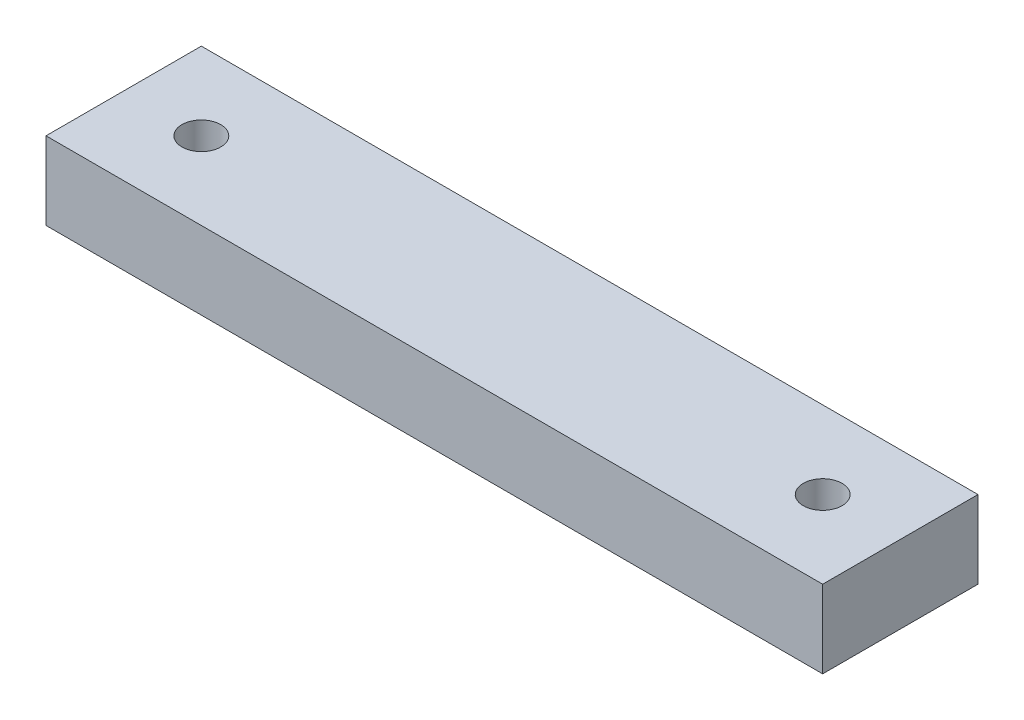
ISO-10303-21;
HEADER;
FILE_DESCRIPTION(('STEP AP214'),'2;1');
FILE_NAME('part.step','',(''),(''),'','','');
FILE_SCHEMA(('AUTOMOTIVE_DESIGN { 1 0 10303 214 1 1 1 1 }'));
ENDSEC;
DATA;
#1=APPLICATION_CONTEXT('core data for automotive mechanical design processes');
#2=APPLICATION_PROTOCOL_DEFINITION('international standard','automotive_design',2000,#1);
#3=PRODUCT_CONTEXT('',#1,'mechanical');
#4=PRODUCT('Part','Part','',(#3));
#5=PRODUCT_RELATED_PRODUCT_CATEGORY('part','',(#4));
#6=PRODUCT_DEFINITION_FORMATION('','',#4);
#7=PRODUCT_DEFINITION_CONTEXT('part definition',#1,'design');
#8=PRODUCT_DEFINITION('design','',#6,#7);
#9=PRODUCT_DEFINITION_SHAPE('','',#8);
#10=(LENGTH_UNIT() NAMED_UNIT(*) SI_UNIT(.MILLI.,.METRE.));
#11=(NAMED_UNIT(*) PLANE_ANGLE_UNIT() SI_UNIT($,.RADIAN.));
#12=(NAMED_UNIT(*) SI_UNIT($,.STERADIAN.) SOLID_ANGLE_UNIT());
#13=UNCERTAINTY_MEASURE_WITH_UNIT(LENGTH_MEASURE(1.E-05),#10,'distance_accuracy_value','');
#14=(GEOMETRIC_REPRESENTATION_CONTEXT(3) GLOBAL_UNCERTAINTY_ASSIGNED_CONTEXT((#13)) GLOBAL_UNIT_ASSIGNED_CONTEXT((#10,
#11,#12)) REPRESENTATION_CONTEXT('',''));
#15=CARTESIAN_POINT('',(0.,0.,0.));
#16=DIRECTION('',(0.,0.,1.));
#17=DIRECTION('',(1.,0.,0.));
#18=AXIS2_PLACEMENT_3D('',#15,#16,#17);
#19=CARTESIAN_POINT('',(0.,10.,0.));
#20=DIRECTION('',(0.,-1.,0.));
#21=DIRECTION('',(0.,0.,-1.));
#22=AXIS2_PLACEMENT_3D('',#19,#20,#21);
#23=PLANE('',#22);
#24=DIRECTION('',(0.,0.,-1.));
#25=VECTOR('',#24,1.);
#26=CARTESIAN_POINT('',(50.,10.,10.));
#27=LINE('',#26,#25);
#28=CARTESIAN_POINT('',(50.,10.,10.));
#29=VERTEX_POINT('',#28);
#30=CARTESIAN_POINT('',(50.,10.,-10.));
#31=VERTEX_POINT('',#30);
#32=EDGE_CURVE('E88',#29,#31,#27,.T.);
#33=ORIENTED_EDGE('',*,*,#32,.T.);
#34=DIRECTION('',(-1.,0.,0.));
#35=VECTOR('',#34,1.);
#36=CARTESIAN_POINT('',(-50.,10.,-10.));
#37=LINE('',#36,#35);
#38=CARTESIAN_POINT('',(-50.,10.,-10.));
#39=VERTEX_POINT('',#38);
#40=EDGE_CURVE('E83',#31,#39,#37,.T.);
#41=ORIENTED_EDGE('',*,*,#40,.T.);
#42=DIRECTION('',(0.,0.,1.));
#43=VECTOR('',#42,1.);
#44=CARTESIAN_POINT('',(-50.,10.,10.));
#45=LINE('',#44,#43);
#46=CARTESIAN_POINT('',(-50.,10.,10.));
#47=VERTEX_POINT('',#46);
#48=EDGE_CURVE('E86',#39,#47,#45,.T.);
#49=ORIENTED_EDGE('',*,*,#48,.T.);
#50=DIRECTION('',(1.,0.,0.));
#51=VECTOR('',#50,1.);
#52=CARTESIAN_POINT('',(-50.,10.,10.));
#53=LINE('',#52,#51);
#54=EDGE_CURVE('E53',#47,#29,#53,.T.);
#55=ORIENTED_EDGE('',*,*,#54,.T.);
#56=EDGE_LOOP('',(#33,#41,#49,#55));
#57=FACE_BOUND('',#56,.T.);
#58=CARTESIAN_POINT('',(-40.,10.,0.));
#59=DIRECTION('',(0.,1.,0.));
#60=DIRECTION('',(0.,0.,1.));
#61=AXIS2_PLACEMENT_3D('',#58,#59,#60);
#62=CIRCLE('',#61,2.5);
#63=CARTESIAN_POINT('',(-40.,10.,2.5));
#64=VERTEX_POINT('',#63);
#65=EDGE_CURVE('E103',#64,#64,#62,.T.);
#66=ORIENTED_EDGE('',*,*,#65,.F.);
#67=EDGE_LOOP('',(#66));
#68=FACE_BOUND('',#67,.T.);
#69=CARTESIAN_POINT('',(40.,10.,0.));
#70=DIRECTION('',(0.,1.,0.));
#71=DIRECTION('',(0.,0.,1.));
#72=AXIS2_PLACEMENT_3D('',#69,#70,#71);
#73=CIRCLE('',#72,2.5);
#74=CARTESIAN_POINT('',(40.,10.,2.5));
#75=VERTEX_POINT('',#74);
#76=EDGE_CURVE('E118',#75,#75,#73,.T.);
#77=ORIENTED_EDGE('',*,*,#76,.F.);
#78=EDGE_LOOP('',(#77));
#79=FACE_BOUND('',#78,.T.);
#80=ADVANCED_FACE('F36',(#57,#68,#79),#23,.F.);
#81=CARTESIAN_POINT('',(0.,0.,0.));
#82=DIRECTION('',(0.,-1.,0.));
#83=DIRECTION('',(0.,0.,-1.));
#84=AXIS2_PLACEMENT_3D('',#81,#82,#83);
#85=PLANE('',#84);
#86=CARTESIAN_POINT('',(-40.,0.,0.));
#87=DIRECTION('',(0.,1.,0.));
#88=DIRECTION('',(0.,0.,1.));
#89=AXIS2_PLACEMENT_3D('',#86,#87,#88);
#90=CIRCLE('',#89,2.5);
#91=CARTESIAN_POINT('',(-40.,0.,2.5));
#92=VERTEX_POINT('',#91);
#93=EDGE_CURVE('E115',#92,#92,#90,.T.);
#94=ORIENTED_EDGE('',*,*,#93,.T.);
#95=EDGE_LOOP('',(#94));
#96=FACE_BOUND('',#95,.T.);
#97=DIRECTION('',(0.,0.,-1.));
#98=VECTOR('',#97,1.);
#99=CARTESIAN_POINT('',(50.,0.,10.));
#100=LINE('',#99,#98);
#101=CARTESIAN_POINT('',(50.,0.,10.));
#102=VERTEX_POINT('',#101);
#103=CARTESIAN_POINT('',(50.,0.,-10.));
#104=VERTEX_POINT('',#103);
#105=EDGE_CURVE('E100',#102,#104,#100,.T.);
#106=ORIENTED_EDGE('',*,*,#105,.F.);
#107=DIRECTION('',(1.,0.,0.));
#108=VECTOR('',#107,1.);
#109=CARTESIAN_POINT('',(-50.,0.,10.));
#110=LINE('',#109,#108);
#111=CARTESIAN_POINT('',(-50.,0.,10.));
#112=VERTEX_POINT('',#111);
#113=EDGE_CURVE('E76',#112,#102,#110,.T.);
#114=ORIENTED_EDGE('',*,*,#113,.F.);
#115=DIRECTION('',(0.,0.,1.));
#116=VECTOR('',#115,1.);
#117=CARTESIAN_POINT('',(-50.,0.,10.));
#118=LINE('',#117,#116);
#119=CARTESIAN_POINT('',(-50.,0.,-10.));
#120=VERTEX_POINT('',#119);
#121=EDGE_CURVE('E70',#120,#112,#118,.T.);
#122=ORIENTED_EDGE('',*,*,#121,.F.);
#123=DIRECTION('',(-1.,0.,0.));
#124=VECTOR('',#123,1.);
#125=CARTESIAN_POINT('',(-50.,0.,-10.));
#126=LINE('',#125,#124);
#127=EDGE_CURVE('E92',#104,#120,#126,.T.);
#128=ORIENTED_EDGE('',*,*,#127,.F.);
#129=EDGE_LOOP('',(#106,#114,#122,#128));
#130=FACE_BOUND('',#129,.T.);
#131=CARTESIAN_POINT('',(40.,0.,0.));
#132=DIRECTION('',(0.,1.,0.));
#133=DIRECTION('',(0.,0.,1.));
#134=AXIS2_PLACEMENT_3D('',#131,#132,#133);
#135=CIRCLE('',#134,2.5);
#136=CARTESIAN_POINT('',(40.,0.,2.5));
#137=VERTEX_POINT('',#136);
#138=EDGE_CURVE('E121',#137,#137,#135,.T.);
#139=ORIENTED_EDGE('',*,*,#138,.T.);
#140=EDGE_LOOP('',(#139));
#141=FACE_BOUND('',#140,.T.);
#142=ADVANCED_FACE('F111',(#96,#130,#141),#85,.T.);
#143=CARTESIAN_POINT('',(50.,10.,10.));
#144=DIRECTION('',(-1.,0.,0.));
#145=DIRECTION('',(0.,0.,1.));
#146=AXIS2_PLACEMENT_3D('',#143,#144,#145);
#147=PLANE('',#146);
#148=ORIENTED_EDGE('',*,*,#105,.T.);
#149=DIRECTION('',(0.,-1.,0.));
#150=VECTOR('',#149,1.);
#151=CARTESIAN_POINT('',(50.,10.,-10.));
#152=LINE('',#151,#150);
#153=EDGE_CURVE('E11',#31,#104,#152,.T.);
#154=ORIENTED_EDGE('',*,*,#153,.F.);
#155=ORIENTED_EDGE('',*,*,#32,.F.);
#156=DIRECTION('',(0.,-1.,0.));
#157=VECTOR('',#156,1.);
#158=CARTESIAN_POINT('',(50.,10.,10.));
#159=LINE('',#158,#157);
#160=EDGE_CURVE('E96',#29,#102,#159,.T.);
#161=ORIENTED_EDGE('',*,*,#160,.T.);
#162=EDGE_LOOP('',(#148,#154,#155,#161));
#163=FACE_BOUND('',#162,.T.);
#164=ADVANCED_FACE('F38',(#163),#147,.F.);
#165=CARTESIAN_POINT('',(-50.,10.,-10.));
#166=DIRECTION('',(0.,0.,1.));
#167=DIRECTION('',(1.,0.,0.));
#168=AXIS2_PLACEMENT_3D('',#165,#166,#167);
#169=PLANE('',#168);
#170=ORIENTED_EDGE('',*,*,#127,.T.);
#171=DIRECTION('',(0.,-1.,0.));
#172=VECTOR('',#171,1.);
#173=CARTESIAN_POINT('',(-50.,10.,-10.));
#174=LINE('',#173,#172);
#175=EDGE_CURVE('E45',#39,#120,#174,.T.);
#176=ORIENTED_EDGE('',*,*,#175,.F.);
#177=ORIENTED_EDGE('',*,*,#40,.F.);
#178=ORIENTED_EDGE('',*,*,#153,.T.);
#179=EDGE_LOOP('',(#170,#176,#177,#178));
#180=FACE_BOUND('',#179,.T.);
#181=ADVANCED_FACE('F91',(#180),#169,.F.);
#182=CARTESIAN_POINT('',(-50.,10.,10.));
#183=DIRECTION('',(1.,0.,0.));
#184=DIRECTION('',(0.,0.,-1.));
#185=AXIS2_PLACEMENT_3D('',#182,#183,#184);
#186=PLANE('',#185);
#187=ORIENTED_EDGE('',*,*,#121,.T.);
#188=DIRECTION('',(0.,-1.,0.));
#189=VECTOR('',#188,1.);
#190=CARTESIAN_POINT('',(-50.,10.,10.));
#191=LINE('',#190,#189);
#192=EDGE_CURVE('E93',#47,#112,#191,.T.);
#193=ORIENTED_EDGE('',*,*,#192,.F.);
#194=ORIENTED_EDGE('',*,*,#48,.F.);
#195=ORIENTED_EDGE('',*,*,#175,.T.);
#196=EDGE_LOOP('',(#187,#193,#194,#195));
#197=FACE_BOUND('',#196,.T.);
#198=ADVANCED_FACE('F94',(#197),#186,.F.);
#199=CARTESIAN_POINT('',(-50.,10.,10.));
#200=DIRECTION('',(0.,0.,-1.));
#201=DIRECTION('',(-1.,0.,0.));
#202=AXIS2_PLACEMENT_3D('',#199,#200,#201);
#203=PLANE('',#202);
#204=ORIENTED_EDGE('',*,*,#113,.T.);
#205=ORIENTED_EDGE('',*,*,#160,.F.);
#206=ORIENTED_EDGE('',*,*,#54,.F.);
#207=ORIENTED_EDGE('',*,*,#192,.T.);
#208=EDGE_LOOP('',(#204,#205,#206,#207));
#209=FACE_BOUND('',#208,.T.);
#210=ADVANCED_FACE('F108',(#209),#203,.F.);
#211=CARTESIAN_POINT('',(-40.,10.,0.));
#212=DIRECTION('',(0.,-1.,0.));
#213=DIRECTION('',(0.,0.,-1.));
#214=AXIS2_PLACEMENT_3D('',#211,#212,#213);
#215=CYLINDRICAL_SURFACE('',#214,2.5);
#216=ORIENTED_EDGE('',*,*,#65,.T.);
#217=EDGE_LOOP('',(#216));
#218=FACE_BOUND('',#217,.T.);
#219=ORIENTED_EDGE('',*,*,#93,.F.);
#220=EDGE_LOOP('',(#219));
#221=FACE_BOUND('',#220,.T.);
#222=ADVANCED_FACE('F138',(#218,#221),#215,.F.);
#223=CARTESIAN_POINT('',(40.,10.,0.));
#224=DIRECTION('',(0.,-1.,0.));
#225=DIRECTION('',(0.,0.,-1.));
#226=AXIS2_PLACEMENT_3D('',#223,#224,#225);
#227=CYLINDRICAL_SURFACE('',#226,2.5);
#228=ORIENTED_EDGE('',*,*,#76,.T.);
#229=EDGE_LOOP('',(#228));
#230=FACE_BOUND('',#229,.T.);
#231=ORIENTED_EDGE('',*,*,#138,.F.);
#232=EDGE_LOOP('',(#231));
#233=FACE_BOUND('',#232,.T.);
#234=ADVANCED_FACE('F127',(#230,#233),#227,.F.);
#235=CLOSED_SHELL('',(#80,#142,#164,#181,#198,#210,#222,#234));
#236=MANIFOLD_SOLID_BREP('B2',#235);
#237=ADVANCED_BREP_SHAPE_REPRESENTATION('',(#18,#236),#14);
#238=SHAPE_DEFINITION_REPRESENTATION(#9,#237);
ENDSEC;
END-ISO-10303-21;
